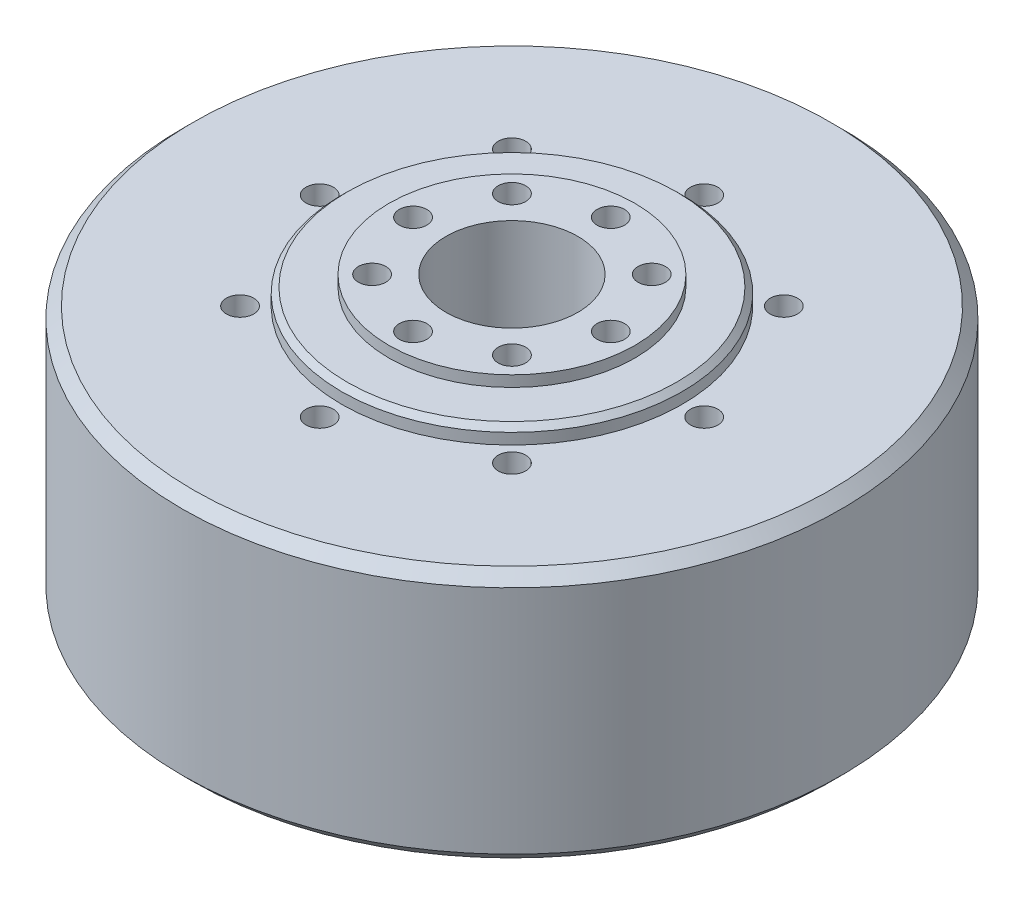
ISO-10303-21;
HEADER;
FILE_DESCRIPTION(('STEP AP214'),'2;1');
FILE_NAME('part.step','',(''),(''),'','','');
FILE_SCHEMA(('AUTOMOTIVE_DESIGN { 1 0 10303 214 1 1 1 1 }'));
ENDSEC;
DATA;
#1=APPLICATION_CONTEXT('core data for automotive mechanical design processes');
#2=APPLICATION_PROTOCOL_DEFINITION('international standard','automotive_design',2000,#1);
#3=PRODUCT_CONTEXT('',#1,'mechanical');
#4=PRODUCT('Part','Part','',(#3));
#5=PRODUCT_RELATED_PRODUCT_CATEGORY('part','',(#4));
#6=PRODUCT_DEFINITION_FORMATION('','',#4);
#7=PRODUCT_DEFINITION_CONTEXT('part definition',#1,'design');
#8=PRODUCT_DEFINITION('design','',#6,#7);
#9=PRODUCT_DEFINITION_SHAPE('','',#8);
#10=(LENGTH_UNIT() NAMED_UNIT(*) SI_UNIT(.MILLI.,.METRE.));
#11=(NAMED_UNIT(*) PLANE_ANGLE_UNIT() SI_UNIT($,.RADIAN.));
#12=(NAMED_UNIT(*) SI_UNIT($,.STERADIAN.) SOLID_ANGLE_UNIT());
#13=UNCERTAINTY_MEASURE_WITH_UNIT(LENGTH_MEASURE(1.E-05),#10,'distance_accuracy_value','');
#14=(GEOMETRIC_REPRESENTATION_CONTEXT(3) GLOBAL_UNCERTAINTY_ASSIGNED_CONTEXT((#13)) GLOBAL_UNIT_ASSIGNED_CONTEXT((#10,
#11,#12)) REPRESENTATION_CONTEXT('',''));
#15=CARTESIAN_POINT('',(0.,0.,0.));
#16=DIRECTION('',(0.,0.,1.));
#17=DIRECTION('',(1.,0.,0.));
#18=AXIS2_PLACEMENT_3D('',#15,#16,#17);
#19=CARTESIAN_POINT('',(0.,46.,0.));
#20=DIRECTION('',(0.,-1.,0.));
#21=DIRECTION('',(0.,0.,-1.));
#22=AXIS2_PLACEMENT_3D('',#19,#20,#21);
#23=CYLINDRICAL_SURFACE('',#22,60.);
#24=CARTESIAN_POINT('',(0.,1.99999999999998,0.));
#25=DIRECTION('',(0.,1.,0.));
#26=DIRECTION('',(0.,0.,1.));
#27=AXIS2_PLACEMENT_3D('',#24,#25,#26);
#28=CIRCLE('',#27,60.);
#29=CARTESIAN_POINT('',(0.,1.99999999999998,60.));
#30=VERTEX_POINT('',#29);
#31=EDGE_CURVE('E61',#30,#30,#28,.T.);
#32=ORIENTED_EDGE('',*,*,#31,.T.);
#33=EDGE_LOOP('',(#32));
#34=FACE_BOUND('',#33,.T.);
#35=CARTESIAN_POINT('',(0.,44.,0.));
#36=DIRECTION('',(0.,1.,0.));
#37=DIRECTION('',(0.,0.,1.));
#38=AXIS2_PLACEMENT_3D('',#35,#36,#37);
#39=CIRCLE('',#38,60.);
#40=CARTESIAN_POINT('',(0.,44.,60.));
#41=VERTEX_POINT('',#40);
#42=EDGE_CURVE('E64',#41,#41,#39,.F.);
#43=ORIENTED_EDGE('',*,*,#42,.T.);
#44=EDGE_LOOP('',(#43));
#45=FACE_BOUND('',#44,.T.);
#46=ADVANCED_FACE('F34',(#34,#45),#23,.T.);
#47=CARTESIAN_POINT('',(0.,46.,0.));
#48=DIRECTION('',(0.,1.,0.));
#49=DIRECTION('',(0.,0.,1.));
#50=AXIS2_PLACEMENT_3D('',#47,#48,#49);
#51=PLANE('',#50);
#52=CARTESIAN_POINT('',(0.,46.,0.));
#53=DIRECTION('',(0.,1.,0.));
#54=DIRECTION('',(0.,0.,1.));
#55=AXIS2_PLACEMENT_3D('',#52,#53,#54);
#56=CIRCLE('',#55,58.);
#57=CARTESIAN_POINT('',(0.,46.,58.));
#58=VERTEX_POINT('',#57);
#59=EDGE_CURVE('E55',#58,#58,#56,.T.);
#60=ORIENTED_EDGE('',*,*,#59,.T.);
#61=EDGE_LOOP('',(#60));
#62=FACE_BOUND('',#61,.T.);
#63=CARTESIAN_POINT('',(0.,46.,-35.));
#64=DIRECTION('',(0.,1.,0.));
#65=DIRECTION('',(0.,0.,1.));
#66=AXIS2_PLACEMENT_3D('',#63,#64,#65);
#67=CIRCLE('',#66,2.5);
#68=CARTESIAN_POINT('',(0.,46.,-32.5));
#69=VERTEX_POINT('',#68);
#70=EDGE_CURVE('E71',#69,#69,#67,.T.);
#71=ORIENTED_EDGE('',*,*,#70,.F.);
#72=EDGE_LOOP('',(#71));
#73=FACE_BOUND('',#72,.T.);
#74=CARTESIAN_POINT('',(24.7487373415292,46.,-24.7487373415291));
#75=DIRECTION('',(0.,1.,0.));
#76=DIRECTION('',(0.,0.,1.));
#77=AXIS2_PLACEMENT_3D('',#74,#75,#76);
#78=CIRCLE('',#77,2.5);
#79=CARTESIAN_POINT('',(24.7487373415292,46.,-22.2487373415291));
#80=VERTEX_POINT('',#79);
#81=EDGE_CURVE('E72',#80,#80,#78,.T.);
#82=ORIENTED_EDGE('',*,*,#81,.F.);
#83=EDGE_LOOP('',(#82));
#84=FACE_BOUND('',#83,.T.);
#85=CARTESIAN_POINT('',(35.0000000000015,46.,-1.48571034940069E-12));
#86=DIRECTION('',(0.,1.,0.));
#87=DIRECTION('',(0.,0.,1.));
#88=AXIS2_PLACEMENT_3D('',#85,#86,#87);
#89=CIRCLE('',#88,2.5);
#90=CARTESIAN_POINT('',(35.0000000000015,46.,2.49999999999852));
#91=VERTEX_POINT('',#90);
#92=EDGE_CURVE('E76',#91,#91,#89,.T.);
#93=ORIENTED_EDGE('',*,*,#92,.F.);
#94=EDGE_LOOP('',(#93));
#95=FACE_BOUND('',#94,.T.);
#96=CARTESIAN_POINT('',(24.7487373415317,46.,24.7487373415281));
#97=DIRECTION('',(0.,1.,0.));
#98=DIRECTION('',(0.,0.,1.));
#99=AXIS2_PLACEMENT_3D('',#96,#97,#98);
#100=CIRCLE('',#99,2.5);
#101=CARTESIAN_POINT('',(24.7487373415317,46.,27.2487373415281));
#102=VERTEX_POINT('',#101);
#103=EDGE_CURVE('E80',#102,#102,#100,.T.);
#104=ORIENTED_EDGE('',*,*,#103,.F.);
#105=EDGE_LOOP('',(#104));
#106=FACE_BOUND('',#105,.T.);
#107=CARTESIAN_POINT('',(2.97142069880137E-12,46.,35.));
#108=DIRECTION('',(0.,1.,0.));
#109=DIRECTION('',(0.,0.,1.));
#110=AXIS2_PLACEMENT_3D('',#107,#108,#109);
#111=CIRCLE('',#110,2.5);
#112=CARTESIAN_POINT('',(2.97142069880137E-12,46.,37.5));
#113=VERTEX_POINT('',#112);
#114=EDGE_CURVE('E84',#113,#113,#111,.T.);
#115=ORIENTED_EDGE('',*,*,#114,.F.);
#116=EDGE_LOOP('',(#115));
#117=FACE_BOUND('',#116,.T.);
#118=CARTESIAN_POINT('',(-24.7487373415266,46.,24.7487373415302));
#119=DIRECTION('',(0.,1.,0.));
#120=DIRECTION('',(0.,0.,1.));
#121=AXIS2_PLACEMENT_3D('',#118,#119,#120);
#122=CIRCLE('',#121,2.5);
#123=CARTESIAN_POINT('',(-24.7487373415266,46.,27.2487373415302));
#124=VERTEX_POINT('',#123);
#125=EDGE_CURVE('E88',#124,#124,#122,.T.);
#126=ORIENTED_EDGE('',*,*,#125,.F.);
#127=EDGE_LOOP('',(#126));
#128=FACE_BOUND('',#127,.T.);
#129=CARTESIAN_POINT('',(-34.9999999999985,46.,1.4899966131977E-12));
#130=DIRECTION('',(0.,1.,0.));
#131=DIRECTION('',(0.,0.,1.));
#132=AXIS2_PLACEMENT_3D('',#129,#130,#131);
#133=CIRCLE('',#132,2.5);
#134=CARTESIAN_POINT('',(-34.9999999999985,46.,2.50000000000149));
#135=VERTEX_POINT('',#134);
#136=EDGE_CURVE('E92',#135,#135,#133,.T.);
#137=ORIENTED_EDGE('',*,*,#136,.F.);
#138=EDGE_LOOP('',(#137));
#139=FACE_BOUND('',#138,.T.);
#140=CARTESIAN_POINT('',(-24.7487373415289,46.,-24.7487373415295));
#141=DIRECTION('',(0.,1.,0.));
#142=DIRECTION('',(0.,0.,1.));
#143=AXIS2_PLACEMENT_3D('',#140,#141,#142);
#144=CIRCLE('',#143,2.5);
#145=CARTESIAN_POINT('',(-24.7487373415289,46.,-22.2487373415295));
#146=VERTEX_POINT('',#145);
#147=EDGE_CURVE('E96',#146,#146,#144,.T.);
#148=ORIENTED_EDGE('',*,*,#147,.F.);
#149=EDGE_LOOP('',(#148));
#150=FACE_BOUND('',#149,.T.);
#151=CARTESIAN_POINT('',(0.,46.,0.));
#152=DIRECTION('',(0.,1.,0.));
#153=DIRECTION('',(0.,0.,1.));
#154=AXIS2_PLACEMENT_3D('',#151,#152,#153);
#155=CIRCLE('',#154,31.);
#156=CARTESIAN_POINT('',(0.,46.,31.));
#157=VERTEX_POINT('',#156);
#158=EDGE_CURVE('E103',#157,#157,#155,.T.);
#159=ORIENTED_EDGE('',*,*,#158,.F.);
#160=EDGE_LOOP('',(#159));
#161=FACE_BOUND('',#160,.T.);
#162=ADVANCED_FACE('F185',(#62,#73,#84,#95,#106,#117,#128,#139,#150,#161),#51,.T.);
#163=CARTESIAN_POINT('',(0.,0.,0.));
#164=DIRECTION('',(0.,1.,0.));
#165=DIRECTION('',(0.,0.,1.));
#166=AXIS2_PLACEMENT_3D('',#163,#164,#165);
#167=PLANE('',#166);
#168=CARTESIAN_POINT('',(0.,0.,0.));
#169=DIRECTION('',(0.,1.,0.));
#170=DIRECTION('',(0.,0.,1.));
#171=AXIS2_PLACEMENT_3D('',#168,#169,#170);
#172=CIRCLE('',#171,58.);
#173=CARTESIAN_POINT('',(0.,0.,58.));
#174=VERTEX_POINT('',#173);
#175=EDGE_CURVE('E58',#174,#174,#172,.F.);
#176=ORIENTED_EDGE('',*,*,#175,.T.);
#177=EDGE_LOOP('',(#176));
#178=FACE_BOUND('',#177,.T.);
#179=CARTESIAN_POINT('',(0.,0.,-35.));
#180=DIRECTION('',(0.,1.,0.));
#181=DIRECTION('',(0.,0.,1.));
#182=AXIS2_PLACEMENT_3D('',#179,#180,#181);
#183=CIRCLE('',#182,2.5);
#184=CARTESIAN_POINT('',(0.,0.,-32.5));
#185=VERTEX_POINT('',#184);
#186=EDGE_CURVE('E68',#185,#185,#183,.T.);
#187=ORIENTED_EDGE('',*,*,#186,.T.);
#188=EDGE_LOOP('',(#187));
#189=FACE_BOUND('',#188,.T.);
#190=CARTESIAN_POINT('',(24.7487373415292,0.,-24.7487373415291));
#191=DIRECTION('',(0.,1.,0.));
#192=DIRECTION('',(0.,0.,1.));
#193=AXIS2_PLACEMENT_3D('',#190,#191,#192);
#194=CIRCLE('',#193,2.5);
#195=CARTESIAN_POINT('',(24.7487373415292,0.,-22.2487373415291));
#196=VERTEX_POINT('',#195);
#197=EDGE_CURVE('E73',#196,#196,#194,.T.);
#198=ORIENTED_EDGE('',*,*,#197,.T.);
#199=EDGE_LOOP('',(#198));
#200=FACE_BOUND('',#199,.T.);
#201=CARTESIAN_POINT('',(35.0000000000015,0.,-1.48571034940069E-12));
#202=DIRECTION('',(0.,1.,0.));
#203=DIRECTION('',(0.,0.,1.));
#204=AXIS2_PLACEMENT_3D('',#201,#202,#203);
#205=CIRCLE('',#204,2.5);
#206=CARTESIAN_POINT('',(35.0000000000015,0.,2.49999999999852));
#207=VERTEX_POINT('',#206);
#208=EDGE_CURVE('E77',#207,#207,#205,.T.);
#209=ORIENTED_EDGE('',*,*,#208,.T.);
#210=EDGE_LOOP('',(#209));
#211=FACE_BOUND('',#210,.T.);
#212=CARTESIAN_POINT('',(24.7487373415317,0.,24.7487373415281));
#213=DIRECTION('',(0.,1.,0.));
#214=DIRECTION('',(0.,0.,1.));
#215=AXIS2_PLACEMENT_3D('',#212,#213,#214);
#216=CIRCLE('',#215,2.5);
#217=CARTESIAN_POINT('',(24.7487373415317,0.,27.2487373415281));
#218=VERTEX_POINT('',#217);
#219=EDGE_CURVE('E81',#218,#218,#216,.T.);
#220=ORIENTED_EDGE('',*,*,#219,.T.);
#221=EDGE_LOOP('',(#220));
#222=FACE_BOUND('',#221,.T.);
#223=CARTESIAN_POINT('',(2.97142069880137E-12,0.,35.));
#224=DIRECTION('',(0.,1.,0.));
#225=DIRECTION('',(0.,0.,1.));
#226=AXIS2_PLACEMENT_3D('',#223,#224,#225);
#227=CIRCLE('',#226,2.5);
#228=CARTESIAN_POINT('',(2.97142069880137E-12,0.,37.5));
#229=VERTEX_POINT('',#228);
#230=EDGE_CURVE('E85',#229,#229,#227,.T.);
#231=ORIENTED_EDGE('',*,*,#230,.T.);
#232=EDGE_LOOP('',(#231));
#233=FACE_BOUND('',#232,.T.);
#234=CARTESIAN_POINT('',(-24.7487373415266,0.,24.7487373415302));
#235=DIRECTION('',(0.,1.,0.));
#236=DIRECTION('',(0.,0.,1.));
#237=AXIS2_PLACEMENT_3D('',#234,#235,#236);
#238=CIRCLE('',#237,2.5);
#239=CARTESIAN_POINT('',(-24.7487373415266,0.,27.2487373415302));
#240=VERTEX_POINT('',#239);
#241=EDGE_CURVE('E89',#240,#240,#238,.T.);
#242=ORIENTED_EDGE('',*,*,#241,.T.);
#243=EDGE_LOOP('',(#242));
#244=FACE_BOUND('',#243,.T.);
#245=CARTESIAN_POINT('',(-34.9999999999985,0.,1.4899966131977E-12));
#246=DIRECTION('',(0.,1.,0.));
#247=DIRECTION('',(0.,0.,1.));
#248=AXIS2_PLACEMENT_3D('',#245,#246,#247);
#249=CIRCLE('',#248,2.5);
#250=CARTESIAN_POINT('',(-34.9999999999985,0.,2.50000000000149));
#251=VERTEX_POINT('',#250);
#252=EDGE_CURVE('E93',#251,#251,#249,.T.);
#253=ORIENTED_EDGE('',*,*,#252,.T.);
#254=EDGE_LOOP('',(#253));
#255=FACE_BOUND('',#254,.T.);
#256=CARTESIAN_POINT('',(-24.7487373415289,0.,-24.7487373415295));
#257=DIRECTION('',(0.,1.,0.));
#258=DIRECTION('',(0.,0.,1.));
#259=AXIS2_PLACEMENT_3D('',#256,#257,#258);
#260=CIRCLE('',#259,2.5);
#261=CARTESIAN_POINT('',(-24.7487373415289,0.,-22.2487373415295));
#262=VERTEX_POINT('',#261);
#263=EDGE_CURVE('E97',#262,#262,#260,.T.);
#264=ORIENTED_EDGE('',*,*,#263,.T.);
#265=EDGE_LOOP('',(#264));
#266=FACE_BOUND('',#265,.T.);
#267=CARTESIAN_POINT('',(0.,0.,0.));
#268=DIRECTION('',(0.,-1.,0.));
#269=DIRECTION('',(0.,0.,-1.));
#270=AXIS2_PLACEMENT_3D('',#267,#268,#269);
#271=CIRCLE('',#270,32.);
#272=CARTESIAN_POINT('',(0.,0.,-32.));
#273=VERTEX_POINT('',#272);
#274=EDGE_CURVE('E100',#273,#273,#271,.T.);
#275=ORIENTED_EDGE('',*,*,#274,.F.);
#276=EDGE_LOOP('',(#275));
#277=FACE_BOUND('',#276,.T.);
#278=ADVANCED_FACE('F188',(#178,#189,#200,#211,#222,#233,#244,#255,#266,#277),#167,.F.);
#279=CARTESIAN_POINT('',(0.,-12.,0.));
#280=DIRECTION('',(0.,1.,0.));
#281=DIRECTION('',(0.,0.,1.));
#282=AXIS2_PLACEMENT_3D('',#279,#280,#281);
#283=CYLINDRICAL_SURFACE('',#282,32.);
#284=CARTESIAN_POINT('',(0.,-11.,0.));
#285=DIRECTION('',(0.,-1.,0.));
#286=DIRECTION('',(0.,0.,-1.));
#287=AXIS2_PLACEMENT_3D('',#284,#285,#286);
#288=CIRCLE('',#287,32.);
#289=CARTESIAN_POINT('',(0.,-11.,-32.));
#290=VERTEX_POINT('',#289);
#291=EDGE_CURVE('E10',#290,#290,#288,.F.);
#292=ORIENTED_EDGE('',*,*,#291,.T.);
#293=EDGE_LOOP('',(#292));
#294=FACE_BOUND('',#293,.T.);
#295=ORIENTED_EDGE('',*,*,#274,.T.);
#296=EDGE_LOOP('',(#295));
#297=FACE_BOUND('',#296,.T.);
#298=ADVANCED_FACE('F206',(#294,#297),#283,.T.);
#299=CARTESIAN_POINT('',(0.,-12.,0.));
#300=DIRECTION('',(0.,-1.,0.));
#301=DIRECTION('',(0.,0.,-1.));
#302=AXIS2_PLACEMENT_3D('',#299,#300,#301);
#303=PLANE('',#302);
#304=CARTESIAN_POINT('',(0.,-12.,0.));
#305=DIRECTION('',(0.,-1.,0.));
#306=DIRECTION('',(0.,0.,-1.));
#307=AXIS2_PLACEMENT_3D('',#304,#305,#306);
#308=CIRCLE('',#307,31.);
#309=CARTESIAN_POINT('',(0.,-12.,-31.));
#310=VERTEX_POINT('',#309);
#311=EDGE_CURVE('E42',#310,#310,#308,.T.);
#312=ORIENTED_EDGE('',*,*,#311,.T.);
#313=EDGE_LOOP('',(#312));
#314=FACE_BOUND('',#313,.T.);
#315=ADVANCED_FACE('F196',(#314),#303,.T.);
#316=CARTESIAN_POINT('',(0.,49.,0.));
#317=DIRECTION('',(0.,-1.,0.));
#318=DIRECTION('',(0.,0.,-1.));
#319=AXIS2_PLACEMENT_3D('',#316,#317,#318);
#320=CYLINDRICAL_SURFACE('',#319,31.);
#321=CARTESIAN_POINT('',(0.,48.,0.));
#322=DIRECTION('',(0.,1.,0.));
#323=DIRECTION('',(0.,0.,1.));
#324=AXIS2_PLACEMENT_3D('',#321,#322,#323);
#325=CIRCLE('',#324,31.);
#326=CARTESIAN_POINT('',(0.,48.,31.));
#327=VERTEX_POINT('',#326);
#328=EDGE_CURVE('E46',#327,#327,#325,.F.);
#329=ORIENTED_EDGE('',*,*,#328,.T.);
#330=EDGE_LOOP('',(#329));
#331=FACE_BOUND('',#330,.T.);
#332=ORIENTED_EDGE('',*,*,#158,.T.);
#333=EDGE_LOOP('',(#332));
#334=FACE_BOUND('',#333,.T.);
#335=ADVANCED_FACE('F193',(#331,#334),#320,.T.);
#336=CARTESIAN_POINT('',(0.,49.,0.));
#337=DIRECTION('',(0.,1.,0.));
#338=DIRECTION('',(0.,0.,1.));
#339=AXIS2_PLACEMENT_3D('',#336,#337,#338);
#340=PLANE('',#339);
#341=CARTESIAN_POINT('',(0.,49.,0.));
#342=DIRECTION('',(0.,1.,0.));
#343=DIRECTION('',(0.,0.,1.));
#344=AXIS2_PLACEMENT_3D('',#341,#342,#343);
#345=CIRCLE('',#344,30.);
#346=CARTESIAN_POINT('',(0.,49.,30.));
#347=VERTEX_POINT('',#346);
#348=EDGE_CURVE('E50',#347,#347,#345,.T.);
#349=ORIENTED_EDGE('',*,*,#348,.T.);
#350=EDGE_LOOP('',(#349));
#351=FACE_BOUND('',#350,.T.);
#352=CARTESIAN_POINT('',(0.,49.,0.));
#353=DIRECTION('',(0.,1.,0.));
#354=DIRECTION('',(0.,0.,1.));
#355=AXIS2_PLACEMENT_3D('',#352,#353,#354);
#356=CIRCLE('',#355,22.4);
#357=CARTESIAN_POINT('',(0.,49.,22.4));
#358=VERTEX_POINT('',#357);
#359=EDGE_CURVE('E67',#358,#358,#356,.T.);
#360=ORIENTED_EDGE('',*,*,#359,.F.);
#361=EDGE_LOOP('',(#360));
#362=FACE_BOUND('',#361,.T.);
#363=ADVANCED_FACE('F195',(#351,#362),#340,.T.);
#364=CARTESIAN_POINT('',(0.,51.,0.));
#365=DIRECTION('',(0.,-1.,0.));
#366=DIRECTION('',(0.,0.,-1.));
#367=AXIS2_PLACEMENT_3D('',#364,#365,#366);
#368=CYLINDRICAL_SURFACE('',#367,22.4);
#369=CARTESIAN_POINT('',(0.,51.,0.));
#370=DIRECTION('',(0.,1.,0.));
#371=DIRECTION('',(0.,0.,1.));
#372=AXIS2_PLACEMENT_3D('',#369,#370,#371);
#373=CIRCLE('',#372,22.4);
#374=CARTESIAN_POINT('',(0.,51.,22.4));
#375=VERTEX_POINT('',#374);
#376=EDGE_CURVE('E104',#375,#375,#373,.T.);
#377=ORIENTED_EDGE('',*,*,#376,.F.);
#378=EDGE_LOOP('',(#377));
#379=FACE_BOUND('',#378,.T.);
#380=ORIENTED_EDGE('',*,*,#359,.T.);
#381=EDGE_LOOP('',(#380));
#382=FACE_BOUND('',#381,.T.);
#383=ADVANCED_FACE('F203',(#379,#382),#368,.T.);
#384=CARTESIAN_POINT('',(0.,51.,0.));
#385=DIRECTION('',(0.,1.,0.));
#386=DIRECTION('',(0.,0.,1.));
#387=AXIS2_PLACEMENT_3D('',#384,#385,#386);
#388=PLANE('',#387);
#389=CARTESIAN_POINT('',(0.,51.,-18.));
#390=DIRECTION('',(0.,1.,0.));
#391=DIRECTION('',(0.,0.,1.));
#392=AXIS2_PLACEMENT_3D('',#389,#390,#391);
#393=CIRCLE('',#392,2.5);
#394=CARTESIAN_POINT('',(0.,51.,-15.5));
#395=VERTEX_POINT('',#394);
#396=EDGE_CURVE('E160',#395,#395,#393,.T.);
#397=ORIENTED_EDGE('',*,*,#396,.F.);
#398=EDGE_LOOP('',(#397));
#399=FACE_BOUND('',#398,.T.);
#400=CARTESIAN_POINT('',(12.7279220613579,51.,-12.7279220613578));
#401=DIRECTION('',(0.,1.,0.));
#402=DIRECTION('',(0.,0.,1.));
#403=AXIS2_PLACEMENT_3D('',#400,#401,#402);
#404=CIRCLE('',#403,2.5);
#405=CARTESIAN_POINT('',(12.7279220613579,51.,-10.2279220613578));
#406=VERTEX_POINT('',#405);
#407=EDGE_CURVE('E154',#406,#406,#404,.T.);
#408=ORIENTED_EDGE('',*,*,#407,.F.);
#409=EDGE_LOOP('',(#408));
#410=FACE_BOUND('',#409,.T.);
#411=CARTESIAN_POINT('',(18.,51.,0.));
#412=DIRECTION('',(0.,1.,0.));
#413=DIRECTION('',(0.,0.,1.));
#414=AXIS2_PLACEMENT_3D('',#411,#412,#413);
#415=CIRCLE('',#414,2.5);
#416=CARTESIAN_POINT('',(18.,51.,2.50000000000006));
#417=VERTEX_POINT('',#416);
#418=EDGE_CURVE('E148',#417,#417,#415,.T.);
#419=ORIENTED_EDGE('',*,*,#418,.F.);
#420=EDGE_LOOP('',(#419));
#421=FACE_BOUND('',#420,.T.);
#422=CARTESIAN_POINT('',(12.7279220613592,51.,12.7279220613573));
#423=DIRECTION('',(0.,1.,0.));
#424=DIRECTION('',(0.,0.,1.));
#425=AXIS2_PLACEMENT_3D('',#422,#423,#424);
#426=CIRCLE('',#425,2.5);
#427=CARTESIAN_POINT('',(12.7279220613592,51.,15.2279220613573));
#428=VERTEX_POINT('',#427);
#429=EDGE_CURVE('E142',#428,#428,#426,.T.);
#430=ORIENTED_EDGE('',*,*,#429,.F.);
#431=EDGE_LOOP('',(#430));
#432=FACE_BOUND('',#431,.T.);
#433=CARTESIAN_POINT('',(1.52815921652642E-12,51.,18.));
#434=DIRECTION('',(0.,1.,0.));
#435=DIRECTION('',(0.,0.,1.));
#436=AXIS2_PLACEMENT_3D('',#433,#434,#435);
#437=CIRCLE('',#436,2.5);
#438=CARTESIAN_POINT('',(1.52815921652642E-12,51.,20.5));
#439=VERTEX_POINT('',#438);
#440=EDGE_CURVE('E136',#439,#439,#437,.T.);
#441=ORIENTED_EDGE('',*,*,#440,.F.);
#442=EDGE_LOOP('',(#441));
#443=FACE_BOUND('',#442,.T.);
#444=CARTESIAN_POINT('',(-12.7279220613566,51.,12.7279220613584));
#445=DIRECTION('',(0.,1.,0.));
#446=DIRECTION('',(0.,0.,1.));
#447=AXIS2_PLACEMENT_3D('',#444,#445,#446);
#448=CIRCLE('',#447,2.5);
#449=CARTESIAN_POINT('',(-12.7279220613566,51.,15.2279220613584));
#450=VERTEX_POINT('',#449);
#451=EDGE_CURVE('E130',#450,#450,#448,.T.);
#452=ORIENTED_EDGE('',*,*,#451,.F.);
#453=EDGE_LOOP('',(#452));
#454=FACE_BOUND('',#453,.T.);
#455=CARTESIAN_POINT('',(-18.,51.,-1.88539992297529E-13));
#456=DIRECTION('',(0.,1.,0.));
#457=DIRECTION('',(0.,0.,1.));
#458=AXIS2_PLACEMENT_3D('',#455,#456,#457);
#459=CIRCLE('',#458,2.5);
#460=CARTESIAN_POINT('',(-18.,51.,2.49999999999981));
#461=VERTEX_POINT('',#460);
#462=EDGE_CURVE('E124',#461,#461,#459,.T.);
#463=ORIENTED_EDGE('',*,*,#462,.F.);
#464=EDGE_LOOP('',(#463));
#465=FACE_BOUND('',#464,.T.);
#466=CARTESIAN_POINT('',(-12.7279220613577,51.,-12.727922061358));
#467=DIRECTION('',(0.,1.,0.));
#468=DIRECTION('',(0.,0.,1.));
#469=AXIS2_PLACEMENT_3D('',#466,#467,#468);
#470=CIRCLE('',#469,2.5);
#471=CARTESIAN_POINT('',(-12.7279220613577,51.,-10.227922061358));
#472=VERTEX_POINT('',#471);
#473=EDGE_CURVE('E118',#472,#472,#470,.T.);
#474=ORIENTED_EDGE('',*,*,#473,.F.);
#475=EDGE_LOOP('',(#474));
#476=FACE_BOUND('',#475,.T.);
#477=CARTESIAN_POINT('',(0.,51.,0.));
#478=DIRECTION('',(0.,1.,0.));
#479=DIRECTION('',(0.,0.,1.));
#480=AXIS2_PLACEMENT_3D('',#477,#478,#479);
#481=CIRCLE('',#480,12.);
#482=CARTESIAN_POINT('',(0.,51.,12.));
#483=VERTEX_POINT('',#482);
#484=EDGE_CURVE('E112',#483,#483,#481,.T.);
#485=ORIENTED_EDGE('',*,*,#484,.F.);
#486=EDGE_LOOP('',(#485));
#487=FACE_BOUND('',#486,.T.);
#488=ORIENTED_EDGE('',*,*,#376,.T.);
#489=EDGE_LOOP('',(#488));
#490=FACE_BOUND('',#489,.T.);
#491=ADVANCED_FACE('F247',(#399,#410,#421,#432,#443,#454,#465,#476,#487,#490),#388,.T.);
#492=CARTESIAN_POINT('',(0.,1.,0.));
#493=DIRECTION('',(0.,1.,0.));
#494=DIRECTION('',(0.,0.,1.));
#495=AXIS2_PLACEMENT_3D('',#492,#493,#494);
#496=CYLINDRICAL_SURFACE('',#495,12.);
#497=CARTESIAN_POINT('',(0.,1.,0.));
#498=DIRECTION('',(0.,1.,0.));
#499=DIRECTION('',(0.,0.,1.));
#500=AXIS2_PLACEMENT_3D('',#497,#498,#499);
#501=CIRCLE('',#500,12.);
#502=CARTESIAN_POINT('',(0.,1.,12.));
#503=VERTEX_POINT('',#502);
#504=EDGE_CURVE('E111',#503,#503,#501,.T.);
#505=ORIENTED_EDGE('',*,*,#504,.F.);
#506=EDGE_LOOP('',(#505));
#507=FACE_BOUND('',#506,.T.);
#508=ORIENTED_EDGE('',*,*,#484,.T.);
#509=EDGE_LOOP('',(#508));
#510=FACE_BOUND('',#509,.T.);
#511=ADVANCED_FACE('F253',(#507,#510),#496,.F.);
#512=CARTESIAN_POINT('',(0.,1.,0.));
#513=DIRECTION('',(0.,1.,0.));
#514=DIRECTION('',(0.,0.,1.));
#515=AXIS2_PLACEMENT_3D('',#512,#513,#514);
#516=PLANE('',#515);
#517=ORIENTED_EDGE('',*,*,#504,.T.);
#518=EDGE_LOOP('',(#517));
#519=FACE_BOUND('',#518,.T.);
#520=ADVANCED_FACE('F260',(#519),#516,.T.);
#521=CARTESIAN_POINT('',(-12.7279220613577,39.,-12.727922061358));
#522=DIRECTION('',(0.,1.,0.));
#523=DIRECTION('',(0.,0.,1.));
#524=AXIS2_PLACEMENT_3D('',#521,#522,#523);
#525=CYLINDRICAL_SURFACE('',#524,2.5);
#526=CARTESIAN_POINT('',(-12.7279220613577,39.,-12.727922061358));
#527=DIRECTION('',(0.,1.,0.));
#528=DIRECTION('',(0.,0.,1.));
#529=AXIS2_PLACEMENT_3D('',#526,#527,#528);
#530=CIRCLE('',#529,2.5);
#531=CARTESIAN_POINT('',(-12.7279220613577,39.,-10.227922061358));
#532=VERTEX_POINT('',#531);
#533=EDGE_CURVE('E121',#532,#532,#530,.T.);
#534=ORIENTED_EDGE('',*,*,#533,.F.);
#535=EDGE_LOOP('',(#534));
#536=FACE_BOUND('',#535,.T.);
#537=ORIENTED_EDGE('',*,*,#473,.T.);
#538=EDGE_LOOP('',(#537));
#539=FACE_BOUND('',#538,.T.);
#540=ADVANCED_FACE('F264',(#536,#539),#525,.F.);
#541=CARTESIAN_POINT('',(-12.7279220613577,39.,-12.727922061358));
#542=DIRECTION('',(0.,1.,0.));
#543=DIRECTION('',(0.,0.,1.));
#544=AXIS2_PLACEMENT_3D('',#541,#542,#543);
#545=PLANE('',#544);
#546=ORIENTED_EDGE('',*,*,#533,.T.);
#547=EDGE_LOOP('',(#546));
#548=FACE_BOUND('',#547,.T.);
#549=ADVANCED_FACE('F268',(#548),#545,.T.);
#550=CARTESIAN_POINT('',(-18.,39.,-1.88539992297529E-13));
#551=DIRECTION('',(0.,1.,0.));
#552=DIRECTION('',(0.,0.,1.));
#553=AXIS2_PLACEMENT_3D('',#550,#551,#552);
#554=CYLINDRICAL_SURFACE('',#553,2.5);
#555=CARTESIAN_POINT('',(-18.,39.,-1.88539992297529E-13));
#556=DIRECTION('',(0.,1.,0.));
#557=DIRECTION('',(0.,0.,1.));
#558=AXIS2_PLACEMENT_3D('',#555,#556,#557);
#559=CIRCLE('',#558,2.5);
#560=CARTESIAN_POINT('',(-18.,39.,2.49999999999981));
#561=VERTEX_POINT('',#560);
#562=EDGE_CURVE('E127',#561,#561,#559,.T.);
#563=ORIENTED_EDGE('',*,*,#562,.F.);
#564=EDGE_LOOP('',(#563));
#565=FACE_BOUND('',#564,.T.);
#566=ORIENTED_EDGE('',*,*,#462,.T.);
#567=EDGE_LOOP('',(#566));
#568=FACE_BOUND('',#567,.T.);
#569=ADVANCED_FACE('F272',(#565,#568),#554,.F.);
#570=CARTESIAN_POINT('',(-18.,39.,-1.88539992297529E-13));
#571=DIRECTION('',(0.,1.,0.));
#572=DIRECTION('',(0.,0.,1.));
#573=AXIS2_PLACEMENT_3D('',#570,#571,#572);
#574=PLANE('',#573);
#575=ORIENTED_EDGE('',*,*,#562,.T.);
#576=EDGE_LOOP('',(#575));
#577=FACE_BOUND('',#576,.T.);
#578=ADVANCED_FACE('F276',(#577),#574,.T.);
#579=CARTESIAN_POINT('',(-12.7279220613566,39.,12.7279220613584));
#580=DIRECTION('',(0.,1.,0.));
#581=DIRECTION('',(0.,0.,1.));
#582=AXIS2_PLACEMENT_3D('',#579,#580,#581);
#583=CYLINDRICAL_SURFACE('',#582,2.5);
#584=CARTESIAN_POINT('',(-12.7279220613566,39.,12.7279220613584));
#585=DIRECTION('',(0.,1.,0.));
#586=DIRECTION('',(0.,0.,1.));
#587=AXIS2_PLACEMENT_3D('',#584,#585,#586);
#588=CIRCLE('',#587,2.5);
#589=CARTESIAN_POINT('',(-12.7279220613566,39.,15.2279220613584));
#590=VERTEX_POINT('',#589);
#591=EDGE_CURVE('E133',#590,#590,#588,.T.);
#592=ORIENTED_EDGE('',*,*,#591,.F.);
#593=EDGE_LOOP('',(#592));
#594=FACE_BOUND('',#593,.T.);
#595=ORIENTED_EDGE('',*,*,#451,.T.);
#596=EDGE_LOOP('',(#595));
#597=FACE_BOUND('',#596,.T.);
#598=ADVANCED_FACE('F280',(#594,#597),#583,.F.);
#599=CARTESIAN_POINT('',(-12.7279220613566,39.,12.7279220613584));
#600=DIRECTION('',(0.,1.,0.));
#601=DIRECTION('',(0.,0.,1.));
#602=AXIS2_PLACEMENT_3D('',#599,#600,#601);
#603=PLANE('',#602);
#604=ORIENTED_EDGE('',*,*,#591,.T.);
#605=EDGE_LOOP('',(#604));
#606=FACE_BOUND('',#605,.T.);
#607=ADVANCED_FACE('F284',(#606),#603,.T.);
#608=CARTESIAN_POINT('',(1.52815921652642E-12,39.,18.));
#609=DIRECTION('',(0.,1.,0.));
#610=DIRECTION('',(0.,0.,1.));
#611=AXIS2_PLACEMENT_3D('',#608,#609,#610);
#612=CYLINDRICAL_SURFACE('',#611,2.5);
#613=CARTESIAN_POINT('',(1.52815921652642E-12,39.,18.));
#614=DIRECTION('',(0.,1.,0.));
#615=DIRECTION('',(0.,0.,1.));
#616=AXIS2_PLACEMENT_3D('',#613,#614,#615);
#617=CIRCLE('',#616,2.5);
#618=CARTESIAN_POINT('',(1.52815921652642E-12,39.,20.5));
#619=VERTEX_POINT('',#618);
#620=EDGE_CURVE('E139',#619,#619,#617,.T.);
#621=ORIENTED_EDGE('',*,*,#620,.F.);
#622=EDGE_LOOP('',(#621));
#623=FACE_BOUND('',#622,.T.);
#624=ORIENTED_EDGE('',*,*,#440,.T.);
#625=EDGE_LOOP('',(#624));
#626=FACE_BOUND('',#625,.T.);
#627=ADVANCED_FACE('F288',(#623,#626),#612,.F.);
#628=CARTESIAN_POINT('',(1.52815921652642E-12,39.,18.));
#629=DIRECTION('',(0.,1.,0.));
#630=DIRECTION('',(0.,0.,1.));
#631=AXIS2_PLACEMENT_3D('',#628,#629,#630);
#632=PLANE('',#631);
#633=ORIENTED_EDGE('',*,*,#620,.T.);
#634=EDGE_LOOP('',(#633));
#635=FACE_BOUND('',#634,.T.);
#636=ADVANCED_FACE('F292',(#635),#632,.T.);
#637=CARTESIAN_POINT('',(12.7279220613592,39.,12.7279220613573));
#638=DIRECTION('',(0.,1.,0.));
#639=DIRECTION('',(0.,0.,1.));
#640=AXIS2_PLACEMENT_3D('',#637,#638,#639);
#641=CYLINDRICAL_SURFACE('',#640,2.5);
#642=CARTESIAN_POINT('',(12.7279220613592,39.,12.7279220613573));
#643=DIRECTION('',(0.,1.,0.));
#644=DIRECTION('',(0.,0.,1.));
#645=AXIS2_PLACEMENT_3D('',#642,#643,#644);
#646=CIRCLE('',#645,2.5);
#647=CARTESIAN_POINT('',(12.7279220613592,39.,15.2279220613573));
#648=VERTEX_POINT('',#647);
#649=EDGE_CURVE('E145',#648,#648,#646,.T.);
#650=ORIENTED_EDGE('',*,*,#649,.F.);
#651=EDGE_LOOP('',(#650));
#652=FACE_BOUND('',#651,.T.);
#653=ORIENTED_EDGE('',*,*,#429,.T.);
#654=EDGE_LOOP('',(#653));
#655=FACE_BOUND('',#654,.T.);
#656=ADVANCED_FACE('F296',(#652,#655),#641,.F.);
#657=CARTESIAN_POINT('',(12.7279220613592,39.,12.7279220613573));
#658=DIRECTION('',(0.,1.,0.));
#659=DIRECTION('',(0.,0.,1.));
#660=AXIS2_PLACEMENT_3D('',#657,#658,#659);
#661=PLANE('',#660);
#662=ORIENTED_EDGE('',*,*,#649,.T.);
#663=EDGE_LOOP('',(#662));
#664=FACE_BOUND('',#663,.T.);
#665=ADVANCED_FACE('F300',(#664),#661,.T.);
#666=CARTESIAN_POINT('',(18.,39.,0.));
#667=DIRECTION('',(0.,1.,0.));
#668=DIRECTION('',(0.,0.,1.));
#669=AXIS2_PLACEMENT_3D('',#666,#667,#668);
#670=CYLINDRICAL_SURFACE('',#669,2.5);
#671=CARTESIAN_POINT('',(18.,39.,0.));
#672=DIRECTION('',(0.,1.,0.));
#673=DIRECTION('',(0.,0.,1.));
#674=AXIS2_PLACEMENT_3D('',#671,#672,#673);
#675=CIRCLE('',#674,2.5);
#676=CARTESIAN_POINT('',(18.,39.,2.50000000000006));
#677=VERTEX_POINT('',#676);
#678=EDGE_CURVE('E151',#677,#677,#675,.T.);
#679=ORIENTED_EDGE('',*,*,#678,.F.);
#680=EDGE_LOOP('',(#679));
#681=FACE_BOUND('',#680,.T.);
#682=ORIENTED_EDGE('',*,*,#418,.T.);
#683=EDGE_LOOP('',(#682));
#684=FACE_BOUND('',#683,.T.);
#685=ADVANCED_FACE('F304',(#681,#684),#670,.F.);
#686=CARTESIAN_POINT('',(18.,39.,0.));
#687=DIRECTION('',(0.,1.,0.));
#688=DIRECTION('',(0.,0.,1.));
#689=AXIS2_PLACEMENT_3D('',#686,#687,#688);
#690=PLANE('',#689);
#691=ORIENTED_EDGE('',*,*,#678,.T.);
#692=EDGE_LOOP('',(#691));
#693=FACE_BOUND('',#692,.T.);
#694=ADVANCED_FACE('F308',(#693),#690,.T.);
#695=CARTESIAN_POINT('',(12.7279220613579,39.,-12.7279220613578));
#696=DIRECTION('',(0.,1.,0.));
#697=DIRECTION('',(0.,0.,1.));
#698=AXIS2_PLACEMENT_3D('',#695,#696,#697);
#699=CYLINDRICAL_SURFACE('',#698,2.5);
#700=CARTESIAN_POINT('',(12.7279220613579,39.,-12.7279220613578));
#701=DIRECTION('',(0.,1.,0.));
#702=DIRECTION('',(0.,0.,1.));
#703=AXIS2_PLACEMENT_3D('',#700,#701,#702);
#704=CIRCLE('',#703,2.5);
#705=CARTESIAN_POINT('',(12.7279220613579,39.,-10.2279220613578));
#706=VERTEX_POINT('',#705);
#707=EDGE_CURVE('E157',#706,#706,#704,.T.);
#708=ORIENTED_EDGE('',*,*,#707,.F.);
#709=EDGE_LOOP('',(#708));
#710=FACE_BOUND('',#709,.T.);
#711=ORIENTED_EDGE('',*,*,#407,.T.);
#712=EDGE_LOOP('',(#711));
#713=FACE_BOUND('',#712,.T.);
#714=ADVANCED_FACE('F312',(#710,#713),#699,.F.);
#715=CARTESIAN_POINT('',(12.7279220613579,39.,-12.7279220613578));
#716=DIRECTION('',(0.,1.,0.));
#717=DIRECTION('',(0.,0.,1.));
#718=AXIS2_PLACEMENT_3D('',#715,#716,#717);
#719=PLANE('',#718);
#720=ORIENTED_EDGE('',*,*,#707,.T.);
#721=EDGE_LOOP('',(#720));
#722=FACE_BOUND('',#721,.T.);
#723=ADVANCED_FACE('F316',(#722),#719,.T.);
#724=CARTESIAN_POINT('',(0.,39.,-18.));
#725=DIRECTION('',(0.,1.,0.));
#726=DIRECTION('',(0.,0.,1.));
#727=AXIS2_PLACEMENT_3D('',#724,#725,#726);
#728=CYLINDRICAL_SURFACE('',#727,2.5);
#729=CARTESIAN_POINT('',(0.,39.,-18.));
#730=DIRECTION('',(0.,1.,0.));
#731=DIRECTION('',(0.,0.,1.));
#732=AXIS2_PLACEMENT_3D('',#729,#730,#731);
#733=CIRCLE('',#732,2.5);
#734=CARTESIAN_POINT('',(0.,39.,-15.5));
#735=VERTEX_POINT('',#734);
#736=EDGE_CURVE('E115',#735,#735,#733,.T.);
#737=ORIENTED_EDGE('',*,*,#736,.F.);
#738=EDGE_LOOP('',(#737));
#739=FACE_BOUND('',#738,.T.);
#740=ORIENTED_EDGE('',*,*,#396,.T.);
#741=EDGE_LOOP('',(#740));
#742=FACE_BOUND('',#741,.T.);
#743=ADVANCED_FACE('F320',(#739,#742),#728,.F.);
#744=CARTESIAN_POINT('',(0.,39.,-18.));
#745=DIRECTION('',(0.,1.,0.));
#746=DIRECTION('',(0.,0.,1.));
#747=AXIS2_PLACEMENT_3D('',#744,#745,#746);
#748=PLANE('',#747);
#749=ORIENTED_EDGE('',*,*,#736,.T.);
#750=EDGE_LOOP('',(#749));
#751=FACE_BOUND('',#750,.T.);
#752=ADVANCED_FACE('F324',(#751),#748,.T.);
#753=CARTESIAN_POINT('',(-24.7487373415289,-12.,-24.7487373415295));
#754=DIRECTION('',(0.,1.,0.));
#755=DIRECTION('',(0.,0.,1.));
#756=AXIS2_PLACEMENT_3D('',#753,#754,#755);
#757=CYLINDRICAL_SURFACE('',#756,2.5);
#758=ORIENTED_EDGE('',*,*,#147,.T.);
#759=EDGE_LOOP('',(#758));
#760=FACE_BOUND('',#759,.T.);
#761=ORIENTED_EDGE('',*,*,#263,.F.);
#762=EDGE_LOOP('',(#761));
#763=FACE_BOUND('',#762,.T.);
#764=ADVANCED_FACE('F182',(#760,#763),#757,.F.);
#765=CARTESIAN_POINT('',(-34.9999999999985,-12.,1.4899966131977E-12));
#766=DIRECTION('',(0.,1.,0.));
#767=DIRECTION('',(0.,0.,1.));
#768=AXIS2_PLACEMENT_3D('',#765,#766,#767);
#769=CYLINDRICAL_SURFACE('',#768,2.5);
#770=ORIENTED_EDGE('',*,*,#136,.T.);
#771=EDGE_LOOP('',(#770));
#772=FACE_BOUND('',#771,.T.);
#773=ORIENTED_EDGE('',*,*,#252,.F.);
#774=EDGE_LOOP('',(#773));
#775=FACE_BOUND('',#774,.T.);
#776=ADVANCED_FACE('F331',(#772,#775),#769,.F.);
#777=CARTESIAN_POINT('',(-24.7487373415266,-12.,24.7487373415302));
#778=DIRECTION('',(0.,1.,0.));
#779=DIRECTION('',(0.,0.,1.));
#780=AXIS2_PLACEMENT_3D('',#777,#778,#779);
#781=CYLINDRICAL_SURFACE('',#780,2.5);
#782=ORIENTED_EDGE('',*,*,#125,.T.);
#783=EDGE_LOOP('',(#782));
#784=FACE_BOUND('',#783,.T.);
#785=ORIENTED_EDGE('',*,*,#241,.F.);
#786=EDGE_LOOP('',(#785));
#787=FACE_BOUND('',#786,.T.);
#788=ADVANCED_FACE('F334',(#784,#787),#781,.F.);
#789=CARTESIAN_POINT('',(2.97142069880137E-12,-12.,35.));
#790=DIRECTION('',(0.,1.,0.));
#791=DIRECTION('',(0.,0.,1.));
#792=AXIS2_PLACEMENT_3D('',#789,#790,#791);
#793=CYLINDRICAL_SURFACE('',#792,2.5);
#794=ORIENTED_EDGE('',*,*,#114,.T.);
#795=EDGE_LOOP('',(#794));
#796=FACE_BOUND('',#795,.T.);
#797=ORIENTED_EDGE('',*,*,#230,.F.);
#798=EDGE_LOOP('',(#797));
#799=FACE_BOUND('',#798,.T.);
#800=ADVANCED_FACE('F338',(#796,#799),#793,.F.);
#801=CARTESIAN_POINT('',(24.7487373415317,-12.,24.7487373415281));
#802=DIRECTION('',(0.,1.,0.));
#803=DIRECTION('',(0.,0.,1.));
#804=AXIS2_PLACEMENT_3D('',#801,#802,#803);
#805=CYLINDRICAL_SURFACE('',#804,2.5);
#806=ORIENTED_EDGE('',*,*,#103,.T.);
#807=EDGE_LOOP('',(#806));
#808=FACE_BOUND('',#807,.T.);
#809=ORIENTED_EDGE('',*,*,#219,.F.);
#810=EDGE_LOOP('',(#809));
#811=FACE_BOUND('',#810,.T.);
#812=ADVANCED_FACE('F342',(#808,#811),#805,.F.);
#813=CARTESIAN_POINT('',(35.0000000000015,-12.,-1.48571034940069E-12));
#814=DIRECTION('',(0.,1.,0.));
#815=DIRECTION('',(0.,0.,1.));
#816=AXIS2_PLACEMENT_3D('',#813,#814,#815);
#817=CYLINDRICAL_SURFACE('',#816,2.5);
#818=ORIENTED_EDGE('',*,*,#92,.T.);
#819=EDGE_LOOP('',(#818));
#820=FACE_BOUND('',#819,.T.);
#821=ORIENTED_EDGE('',*,*,#208,.F.);
#822=EDGE_LOOP('',(#821));
#823=FACE_BOUND('',#822,.T.);
#824=ADVANCED_FACE('F346',(#820,#823),#817,.F.);
#825=CARTESIAN_POINT('',(24.7487373415292,-12.,-24.7487373415291));
#826=DIRECTION('',(0.,1.,0.));
#827=DIRECTION('',(0.,0.,1.));
#828=AXIS2_PLACEMENT_3D('',#825,#826,#827);
#829=CYLINDRICAL_SURFACE('',#828,2.5);
#830=ORIENTED_EDGE('',*,*,#81,.T.);
#831=EDGE_LOOP('',(#830));
#832=FACE_BOUND('',#831,.T.);
#833=ORIENTED_EDGE('',*,*,#197,.F.);
#834=EDGE_LOOP('',(#833));
#835=FACE_BOUND('',#834,.T.);
#836=ADVANCED_FACE('F350',(#832,#835),#829,.F.);
#837=CARTESIAN_POINT('',(0.,-12.,-35.));
#838=DIRECTION('',(0.,1.,0.));
#839=DIRECTION('',(0.,0.,1.));
#840=AXIS2_PLACEMENT_3D('',#837,#838,#839);
#841=CYLINDRICAL_SURFACE('',#840,2.5);
#842=ORIENTED_EDGE('',*,*,#70,.T.);
#843=EDGE_LOOP('',(#842));
#844=FACE_BOUND('',#843,.T.);
#845=ORIENTED_EDGE('',*,*,#186,.F.);
#846=EDGE_LOOP('',(#845));
#847=FACE_BOUND('',#846,.T.);
#848=ADVANCED_FACE('F224',(#844,#847),#841,.F.);
#849=CARTESIAN_POINT('',(0.,1.99999999999998,0.));
#850=DIRECTION('',(0.,1.,0.));
#851=DIRECTION('',(0.,0.,1.));
#852=AXIS2_PLACEMENT_3D('',#849,#850,#851);
#853=CONICAL_SURFACE('',#852,60.,0.785398163397452);
#854=ORIENTED_EDGE('',*,*,#175,.F.);
#855=EDGE_LOOP('',(#854));
#856=FACE_BOUND('',#855,.T.);
#857=ORIENTED_EDGE('',*,*,#31,.F.);
#858=EDGE_LOOP('',(#857));
#859=FACE_BOUND('',#858,.T.);
#860=ADVANCED_FACE('F217',(#856,#859),#853,.T.);
#861=CARTESIAN_POINT('',(0.,46.,0.));
#862=DIRECTION('',(0.,-1.,0.));
#863=DIRECTION('',(0.,0.,-1.));
#864=AXIS2_PLACEMENT_3D('',#861,#862,#863);
#865=CONICAL_SURFACE('',#864,58.,0.785398163397447);
#866=ORIENTED_EDGE('',*,*,#42,.F.);
#867=EDGE_LOOP('',(#866));
#868=FACE_BOUND('',#867,.T.);
#869=ORIENTED_EDGE('',*,*,#59,.F.);
#870=EDGE_LOOP('',(#869));
#871=FACE_BOUND('',#870,.T.);
#872=ADVANCED_FACE('F223',(#868,#871),#865,.T.);
#873=CARTESIAN_POINT('',(0.,49.,0.));
#874=DIRECTION('',(0.,-1.,0.));
#875=DIRECTION('',(0.,0.,-1.));
#876=AXIS2_PLACEMENT_3D('',#873,#874,#875);
#877=CONICAL_SURFACE('',#876,30.,0.785398163397448);
#878=ORIENTED_EDGE('',*,*,#328,.F.);
#879=EDGE_LOOP('',(#878));
#880=FACE_BOUND('',#879,.T.);
#881=ORIENTED_EDGE('',*,*,#348,.F.);
#882=EDGE_LOOP('',(#881));
#883=FACE_BOUND('',#882,.T.);
#884=ADVANCED_FACE('F230',(#880,#883),#877,.T.);
#885=CARTESIAN_POINT('',(0.,-12.,0.));
#886=DIRECTION('',(0.,1.,0.));
#887=DIRECTION('',(0.,0.,1.));
#888=AXIS2_PLACEMENT_3D('',#885,#886,#887);
#889=CONICAL_SURFACE('',#888,31.,0.785398163397448);
#890=ORIENTED_EDGE('',*,*,#291,.F.);
#891=EDGE_LOOP('',(#890));
#892=FACE_BOUND('',#891,.T.);
#893=ORIENTED_EDGE('',*,*,#311,.F.);
#894=EDGE_LOOP('',(#893));
#895=FACE_BOUND('',#894,.T.);
#896=ADVANCED_FACE('F37',(#892,#895),#889,.T.);
#897=CLOSED_SHELL('',(#46,#162,#278,#298,#315,#335,#363,#383,#491,#511,#520,#540,#549,#569,#578,
#598,#607,#627,#636,#656,#665,#685,#694,#714,#723,#743,#752,#764,#776,#788,#800,#812,#824,#836,
#848,#860,#872,#884,#896));
#898=MANIFOLD_SOLID_BREP('B2',#897);
#899=ADVANCED_BREP_SHAPE_REPRESENTATION('',(#18,#898),#14);
#900=SHAPE_DEFINITION_REPRESENTATION(#9,#899);
ENDSEC;
END-ISO-10303-21;
